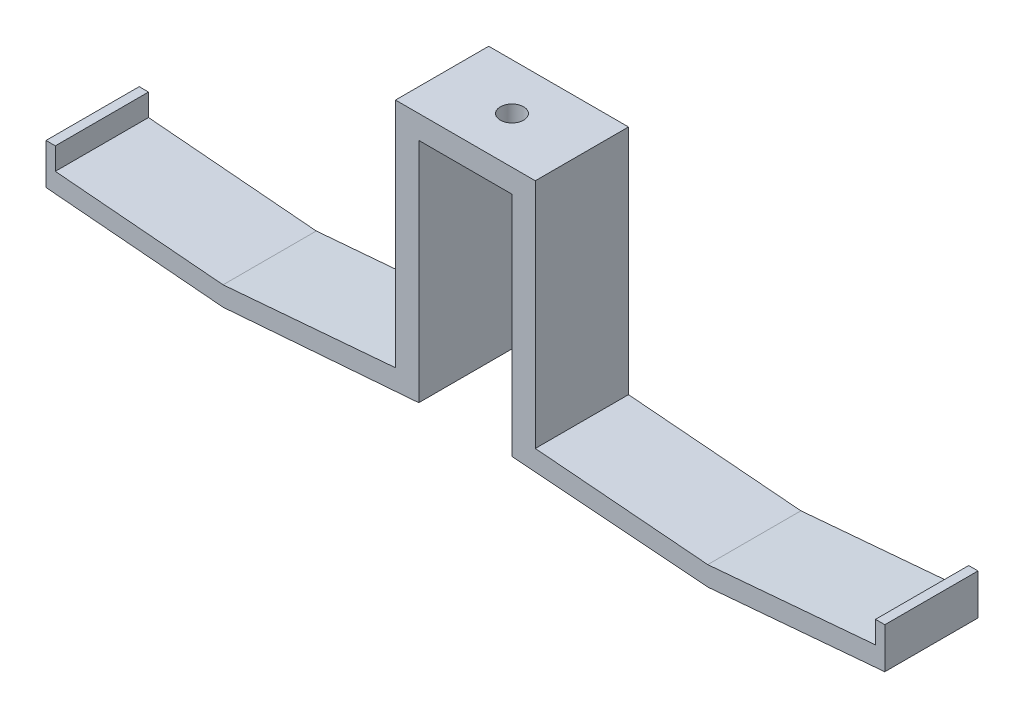
ISO-10303-21;
HEADER;
FILE_DESCRIPTION(('STEP AP214'),'2;1');
FILE_NAME('part.step','',(''),(''),'','','');
FILE_SCHEMA(('AUTOMOTIVE_DESIGN { 1 0 10303 214 1 1 1 1 }'));
ENDSEC;
DATA;
#1=APPLICATION_CONTEXT('core data for automotive mechanical design processes');
#2=APPLICATION_PROTOCOL_DEFINITION('international standard','automotive_design',2000,#1);
#3=PRODUCT_CONTEXT('',#1,'mechanical');
#4=PRODUCT('Part','Part','',(#3));
#5=PRODUCT_RELATED_PRODUCT_CATEGORY('part','',(#4));
#6=PRODUCT_DEFINITION_FORMATION('','',#4);
#7=PRODUCT_DEFINITION_CONTEXT('part definition',#1,'design');
#8=PRODUCT_DEFINITION('design','',#6,#7);
#9=PRODUCT_DEFINITION_SHAPE('','',#8);
#10=(LENGTH_UNIT() NAMED_UNIT(*) SI_UNIT(.MILLI.,.METRE.));
#11=(NAMED_UNIT(*) PLANE_ANGLE_UNIT() SI_UNIT($,.RADIAN.));
#12=(NAMED_UNIT(*) SI_UNIT($,.STERADIAN.) SOLID_ANGLE_UNIT());
#13=UNCERTAINTY_MEASURE_WITH_UNIT(LENGTH_MEASURE(1.E-05),#10,'distance_accuracy_value','');
#14=(GEOMETRIC_REPRESENTATION_CONTEXT(3) GLOBAL_UNCERTAINTY_ASSIGNED_CONTEXT((#13)) GLOBAL_UNIT_ASSIGNED_CONTEXT((#10,
#11,#12)) REPRESENTATION_CONTEXT('',''));
#15=CARTESIAN_POINT('',(0.,0.,0.));
#16=DIRECTION('',(0.,0.,1.));
#17=DIRECTION('',(1.,0.,0.));
#18=AXIS2_PLACEMENT_3D('',#15,#16,#17);
#19=CARTESIAN_POINT('',(-4.57245309052157,-54.8694358998936,25.4000000000001));
#20=DIRECTION('',(0.0830454816369344,0.99654575809628,0.));
#21=DIRECTION('',(-0.99654575809628,0.0830454816369344,0.));
#22=AXIS2_PLACEMENT_3D('',#19,#20,#21);
#23=PLANE('',#22);
#24=DIRECTION('',(0.99654575809628,-0.0830454816369344,0.));
#25=VECTOR('',#24,1.);
#26=CARTESIAN_POINT('',(-4.57245309052157,-54.8694358998936,0.));
#27=LINE('',#26,#25);
#28=CARTESIAN_POINT('',(19.05,-56.8379737,0.));
#29=VERTEX_POINT('',#28);
#30=CARTESIAN_POINT('',(66.0400000000001,-60.7538071179998,0.));
#31=VERTEX_POINT('',#30);
#32=EDGE_CURVE('E202',#29,#31,#27,.T.);
#33=ORIENTED_EDGE('',*,*,#32,.F.);
#34=DIRECTION('',(0.,0.,-1.));
#35=VECTOR('',#34,1.);
#36=CARTESIAN_POINT('',(19.05,-56.8379737,25.4000000000001));
#37=LINE('',#36,#35);
#38=CARTESIAN_POINT('',(19.05,-56.8379737,25.4000000000001));
#39=VERTEX_POINT('',#38);
#40=EDGE_CURVE('E11',#39,#29,#37,.T.);
#41=ORIENTED_EDGE('',*,*,#40,.F.);
#42=DIRECTION('',(0.99654575809628,-0.0830454816369344,0.));
#43=VECTOR('',#42,1.);
#44=CARTESIAN_POINT('',(-4.57245309052157,-54.8694358998936,25.4000000000001));
#45=LINE('',#44,#43);
#46=CARTESIAN_POINT('',(66.0400000000001,-60.7538071179998,25.4000000000001));
#47=VERTEX_POINT('',#46);
#48=EDGE_CURVE('E252',#39,#47,#45,.T.);
#49=ORIENTED_EDGE('',*,*,#48,.T.);
#50=DIRECTION('',(0.,0.,-1.));
#51=VECTOR('',#50,1.);
#52=CARTESIAN_POINT('',(66.0400000000001,-60.7538071179998,25.4000000000001));
#53=LINE('',#52,#51);
#54=EDGE_CURVE('E125',#47,#31,#53,.T.);
#55=ORIENTED_EDGE('',*,*,#54,.T.);
#56=EDGE_LOOP('',(#33,#41,#49,#55));
#57=FACE_BOUND('',#56,.T.);
#58=ADVANCED_FACE('F38',(#57),#23,.T.);
#59=CARTESIAN_POINT('',(19.05,0.,25.4000000000001));
#60=DIRECTION('',(1.,0.,0.));
#61=DIRECTION('',(0.,1.,0.));
#62=AXIS2_PLACEMENT_3D('',#59,#60,#61);
#63=PLANE('',#62);
#64=DIRECTION('',(0.,-1.,0.));
#65=VECTOR('',#64,1.);
#66=CARTESIAN_POINT('',(19.05,0.,0.));
#67=LINE('',#66,#65);
#68=CARTESIAN_POINT('',(19.05,6.35000000000008,0.));
#69=VERTEX_POINT('',#68);
#70=EDGE_CURVE('E205',#69,#29,#67,.T.);
#71=ORIENTED_EDGE('',*,*,#70,.F.);
#72=DIRECTION('',(0.,0.,-1.));
#73=VECTOR('',#72,1.);
#74=CARTESIAN_POINT('',(19.05,6.35000000000008,25.4000000000001));
#75=LINE('',#74,#73);
#76=CARTESIAN_POINT('',(19.05,6.35000000000008,25.4000000000001));
#77=VERTEX_POINT('',#76);
#78=EDGE_CURVE('E46',#77,#69,#75,.T.);
#79=ORIENTED_EDGE('',*,*,#78,.F.);
#80=DIRECTION('',(0.,-1.,0.));
#81=VECTOR('',#80,1.);
#82=CARTESIAN_POINT('',(19.05,0.,25.4000000000001));
#83=LINE('',#82,#81);
#84=EDGE_CURVE('E303',#77,#39,#83,.T.);
#85=ORIENTED_EDGE('',*,*,#84,.T.);
#86=ORIENTED_EDGE('',*,*,#40,.T.);
#87=EDGE_LOOP('',(#71,#79,#85,#86));
#88=FACE_BOUND('',#87,.T.);
#89=ADVANCED_FACE('F302',(#88),#63,.T.);
#90=CARTESIAN_POINT('',(0.,6.35000000000008,25.4000000000001));
#91=DIRECTION('',(0.,-1.,0.));
#92=DIRECTION('',(0.,0.,-1.));
#93=AXIS2_PLACEMENT_3D('',#90,#91,#92);
#94=PLANE('',#93);
#95=CARTESIAN_POINT('',(0.,6.35000000000008,12.6999999999999));
#96=DIRECTION('',(0.,1.,0.));
#97=DIRECTION('',(0.,0.,1.));
#98=AXIS2_PLACEMENT_3D('',#95,#96,#97);
#99=CIRCLE('',#98,3.175);
#100=CARTESIAN_POINT('',(0.,6.35000000000008,15.8749999999999));
#101=VERTEX_POINT('',#100);
#102=EDGE_CURVE('E206',#101,#101,#99,.T.);
#103=ORIENTED_EDGE('',*,*,#102,.F.);
#104=EDGE_LOOP('',(#103));
#105=FACE_BOUND('',#104,.T.);
#106=DIRECTION('',(-1.,0.,0.));
#107=VECTOR('',#106,1.);
#108=CARTESIAN_POINT('',(0.,6.35000000000008,0.));
#109=LINE('',#108,#107);
#110=CARTESIAN_POINT('',(-19.05,6.35000000000008,0.));
#111=VERTEX_POINT('',#110);
#112=EDGE_CURVE('E209',#69,#111,#109,.T.);
#113=ORIENTED_EDGE('',*,*,#112,.T.);
#114=DIRECTION('',(0.,0.,-1.));
#115=VECTOR('',#114,1.);
#116=CARTESIAN_POINT('',(-19.05,6.35000000000008,25.4000000000001));
#117=LINE('',#116,#115);
#118=CARTESIAN_POINT('',(-19.05,6.35000000000008,25.4000000000001));
#119=VERTEX_POINT('',#118);
#120=EDGE_CURVE('E286',#119,#111,#117,.T.);
#121=ORIENTED_EDGE('',*,*,#120,.F.);
#122=DIRECTION('',(-1.,0.,0.));
#123=VECTOR('',#122,1.);
#124=CARTESIAN_POINT('',(0.,6.35000000000008,25.4000000000001));
#125=LINE('',#124,#123);
#126=EDGE_CURVE('E293',#77,#119,#125,.T.);
#127=ORIENTED_EDGE('',*,*,#126,.F.);
#128=ORIENTED_EDGE('',*,*,#78,.T.);
#129=EDGE_LOOP('',(#113,#121,#127,#128));
#130=FACE_BOUND('',#129,.T.);
#131=ADVANCED_FACE('F291',(#105,#130),#94,.F.);
#132=CARTESIAN_POINT('',(-19.05,0.,25.4000000000001));
#133=DIRECTION('',(1.,0.,0.));
#134=DIRECTION('',(0.,1.,0.));
#135=AXIS2_PLACEMENT_3D('',#132,#133,#134);
#136=PLANE('',#135);
#137=DIRECTION('',(0.,-1.,0.));
#138=VECTOR('',#137,1.);
#139=CARTESIAN_POINT('',(-19.05,0.,0.));
#140=LINE('',#139,#138);
#141=CARTESIAN_POINT('',(-19.05,-56.8379737,0.));
#142=VERTEX_POINT('',#141);
#143=EDGE_CURVE('E211',#111,#142,#140,.T.);
#144=ORIENTED_EDGE('',*,*,#143,.T.);
#145=DIRECTION('',(0.,0.,-1.));
#146=VECTOR('',#145,1.);
#147=CARTESIAN_POINT('',(-19.05,-56.8379737,25.4000000000001));
#148=LINE('',#147,#146);
#149=CARTESIAN_POINT('',(-19.05,-56.8379737,25.4000000000001));
#150=VERTEX_POINT('',#149);
#151=EDGE_CURVE('E283',#150,#142,#148,.T.);
#152=ORIENTED_EDGE('',*,*,#151,.F.);
#153=DIRECTION('',(0.,-1.,0.));
#154=VECTOR('',#153,1.);
#155=CARTESIAN_POINT('',(-19.05,0.,25.4000000000001));
#156=LINE('',#155,#154);
#157=EDGE_CURVE('E314',#119,#150,#156,.T.);
#158=ORIENTED_EDGE('',*,*,#157,.F.);
#159=ORIENTED_EDGE('',*,*,#120,.T.);
#160=EDGE_LOOP('',(#144,#152,#158,#159));
#161=FACE_BOUND('',#160,.T.);
#162=ADVANCED_FACE('F404',(#161),#136,.F.);
#163=CARTESIAN_POINT('',(4.57245309052157,-54.8694358998936,25.4000000000001));
#164=DIRECTION('',(0.0830454816369345,-0.99654575809628,0.));
#165=DIRECTION('',(0.99654575809628,0.0830454816369345,0.));
#166=AXIS2_PLACEMENT_3D('',#163,#164,#165);
#167=PLANE('',#166);
#168=DIRECTION('',(-0.99654575809628,-0.0830454816369345,0.));
#169=VECTOR('',#168,1.);
#170=CARTESIAN_POINT('',(4.57245309052157,-54.8694358998936,0.));
#171=LINE('',#170,#169);
#172=CARTESIAN_POINT('',(-66.04,-60.753807118,0.));
#173=VERTEX_POINT('',#172);
#174=EDGE_CURVE('E213',#142,#173,#171,.T.);
#175=ORIENTED_EDGE('',*,*,#174,.T.);
#176=DIRECTION('',(0.,0.,-1.));
#177=VECTOR('',#176,1.);
#178=CARTESIAN_POINT('',(-66.04,-60.753807118,25.4000000000001));
#179=LINE('',#178,#177);
#180=CARTESIAN_POINT('',(-66.04,-60.753807118,25.4000000000001));
#181=VERTEX_POINT('',#180);
#182=EDGE_CURVE('E281',#181,#173,#179,.T.);
#183=ORIENTED_EDGE('',*,*,#182,.F.);
#184=DIRECTION('',(-0.99654575809628,-0.0830454816369345,0.));
#185=VECTOR('',#184,1.);
#186=CARTESIAN_POINT('',(4.57245309052157,-54.8694358998936,25.4000000000001));
#187=LINE('',#186,#185);
#188=EDGE_CURVE('E316',#150,#181,#187,.T.);
#189=ORIENTED_EDGE('',*,*,#188,.F.);
#190=ORIENTED_EDGE('',*,*,#151,.T.);
#191=EDGE_LOOP('',(#175,#183,#189,#190));
#192=FACE_BOUND('',#191,.T.);
#193=ADVANCED_FACE('F400',(#192),#167,.F.);
#194=CARTESIAN_POINT('',(-5.64647427056286,-65.9264008687037,25.4000000000001));
#195=DIRECTION('',(0.0853357272861369,0.996352253798096,0.));
#196=DIRECTION('',(-0.996352253798096,0.0853357272861369,0.));
#197=AXIS2_PLACEMENT_3D('',#194,#195,#196);
#198=PLANE('',#197);
#199=DIRECTION('',(0.996352253798096,-0.0853357272861369,0.));
#200=VECTOR('',#199,1.);
#201=CARTESIAN_POINT('',(-5.64647427056286,-65.9264008687037,0.));
#202=LINE('',#201,#200);
#203=CARTESIAN_POINT('',(-111.76,-56.8379737,0.));
#204=VERTEX_POINT('',#203);
#205=EDGE_CURVE('E216',#204,#173,#202,.T.);
#206=ORIENTED_EDGE('',*,*,#205,.F.);
#207=DIRECTION('',(0.,0.,-1.));
#208=VECTOR('',#207,1.);
#209=CARTESIAN_POINT('',(-111.76,-56.8379737,25.4000000000001));
#210=LINE('',#209,#208);
#211=CARTESIAN_POINT('',(-111.76,-56.8379737,25.4000000000001));
#212=VERTEX_POINT('',#211);
#213=EDGE_CURVE('E279',#212,#204,#210,.T.);
#214=ORIENTED_EDGE('',*,*,#213,.F.);
#215=DIRECTION('',(0.996352253798096,-0.0853357272861369,0.));
#216=VECTOR('',#215,1.);
#217=CARTESIAN_POINT('',(-5.64647427056286,-65.9264008687037,25.4000000000001));
#218=LINE('',#217,#216);
#219=EDGE_CURVE('E318',#212,#181,#218,.T.);
#220=ORIENTED_EDGE('',*,*,#219,.T.);
#221=ORIENTED_EDGE('',*,*,#182,.T.);
#222=EDGE_LOOP('',(#206,#214,#220,#221));
#223=FACE_BOUND('',#222,.T.);
#224=ADVANCED_FACE('F395',(#223),#198,.T.);
#225=CARTESIAN_POINT('',(-111.76,6.66133814775094E-13,25.4000000000001));
#226=DIRECTION('',(1.,0.,0.));
#227=DIRECTION('',(0.,1.,0.));
#228=AXIS2_PLACEMENT_3D('',#225,#226,#227);
#229=PLANE('',#228);
#230=DIRECTION('',(0.,-1.,0.));
#231=VECTOR('',#230,1.);
#232=CARTESIAN_POINT('',(-111.76,6.66133814775094E-13,0.));
#233=LINE('',#232,#231);
#234=CARTESIAN_POINT('',(-111.76,-50.811353419,0.));
#235=VERTEX_POINT('',#234);
#236=EDGE_CURVE('E219',#235,#204,#233,.T.);
#237=ORIENTED_EDGE('',*,*,#236,.F.);
#238=DIRECTION('',(0.,0.,-1.));
#239=VECTOR('',#238,1.);
#240=CARTESIAN_POINT('',(-111.76,-50.811353419,25.4000000000001));
#241=LINE('',#240,#239);
#242=CARTESIAN_POINT('',(-111.76,-50.811353419,25.4000000000001));
#243=VERTEX_POINT('',#242);
#244=EDGE_CURVE('E277',#243,#235,#241,.T.);
#245=ORIENTED_EDGE('',*,*,#244,.F.);
#246=DIRECTION('',(0.,-1.,0.));
#247=VECTOR('',#246,1.);
#248=CARTESIAN_POINT('',(-111.76,6.66133814775094E-13,25.4000000000001));
#249=LINE('',#248,#247);
#250=EDGE_CURVE('E321',#243,#212,#249,.T.);
#251=ORIENTED_EDGE('',*,*,#250,.T.);
#252=ORIENTED_EDGE('',*,*,#213,.T.);
#253=EDGE_LOOP('',(#237,#245,#251,#252));
#254=FACE_BOUND('',#253,.T.);
#255=ADVANCED_FACE('F392',(#254),#229,.T.);
#256=CARTESIAN_POINT('',(0.,-50.811353419,25.4000000000001));
#257=DIRECTION('',(0.,1.,0.));
#258=DIRECTION('',(0.,0.,1.));
#259=AXIS2_PLACEMENT_3D('',#256,#257,#258);
#260=PLANE('',#259);
#261=DIRECTION('',(1.,0.,0.));
#262=VECTOR('',#261,1.);
#263=CARTESIAN_POINT('',(0.,-50.811353419,0.));
#264=LINE('',#263,#262);
#265=CARTESIAN_POINT('',(-114.3,-50.811353419,0.));
#266=VERTEX_POINT('',#265);
#267=EDGE_CURVE('E222',#266,#235,#264,.T.);
#268=ORIENTED_EDGE('',*,*,#267,.F.);
#269=DIRECTION('',(0.,0.,-1.));
#270=VECTOR('',#269,1.);
#271=CARTESIAN_POINT('',(-114.3,-50.811353419,25.4000000000001));
#272=LINE('',#271,#270);
#273=CARTESIAN_POINT('',(-114.3,-50.811353419,25.4000000000001));
#274=VERTEX_POINT('',#273);
#275=EDGE_CURVE('E275',#274,#266,#272,.T.);
#276=ORIENTED_EDGE('',*,*,#275,.F.);
#277=DIRECTION('',(1.,0.,0.));
#278=VECTOR('',#277,1.);
#279=CARTESIAN_POINT('',(0.,-50.811353419,25.4000000000001));
#280=LINE('',#279,#278);
#281=EDGE_CURVE('E324',#274,#243,#280,.T.);
#282=ORIENTED_EDGE('',*,*,#281,.T.);
#283=ORIENTED_EDGE('',*,*,#244,.T.);
#284=EDGE_LOOP('',(#268,#276,#282,#283));
#285=FACE_BOUND('',#284,.T.);
#286=ADVANCED_FACE('F388',(#285),#260,.T.);
#287=CARTESIAN_POINT('',(-114.3,4.44089209850063E-13,25.4000000000001));
#288=DIRECTION('',(-1.,0.,0.));
#289=DIRECTION('',(0.,-1.,0.));
#290=AXIS2_PLACEMENT_3D('',#287,#288,#289);
#291=PLANE('',#290);
#292=DIRECTION('',(0.,1.,0.));
#293=VECTOR('',#292,1.);
#294=CARTESIAN_POINT('',(-114.3,4.44089209850063E-13,0.));
#295=LINE('',#294,#293);
#296=CARTESIAN_POINT('',(-114.3,-61.9179737000002,0.));
#297=VERTEX_POINT('',#296);
#298=EDGE_CURVE('E225',#297,#266,#295,.T.);
#299=ORIENTED_EDGE('',*,*,#298,.F.);
#300=DIRECTION('',(0.,0.,-1.));
#301=VECTOR('',#300,1.);
#302=CARTESIAN_POINT('',(-114.3,-61.9179737000002,25.4000000000001));
#303=LINE('',#302,#301);
#304=CARTESIAN_POINT('',(-114.3,-61.9179737000002,25.4000000000001));
#305=VERTEX_POINT('',#304);
#306=EDGE_CURVE('E273',#305,#297,#303,.T.);
#307=ORIENTED_EDGE('',*,*,#306,.F.);
#308=DIRECTION('',(0.,1.,0.));
#309=VECTOR('',#308,1.);
#310=CARTESIAN_POINT('',(-114.3,4.44089209850063E-13,25.4000000000001));
#311=LINE('',#310,#309);
#312=EDGE_CURVE('E327',#305,#274,#311,.T.);
#313=ORIENTED_EDGE('',*,*,#312,.T.);
#314=ORIENTED_EDGE('',*,*,#275,.T.);
#315=EDGE_LOOP('',(#299,#307,#313,#314));
#316=FACE_BOUND('',#315,.T.);
#317=ADVANCED_FACE('F384',(#316),#291,.T.);
#318=CARTESIAN_POINT('',(-6.09689520048762,-71.1853694503344,25.4000000000001));
#319=DIRECTION('',(-0.0853357272861369,-0.996352253798096,0.));
#320=DIRECTION('',(0.996352253798096,-0.0853357272861369,0.));
#321=AXIS2_PLACEMENT_3D('',#318,#319,#320);
#322=PLANE('',#321);
#323=DIRECTION('',(-0.996352253798096,0.0853357272861369,0.));
#324=VECTOR('',#323,1.);
#325=CARTESIAN_POINT('',(-6.09689520048762,-71.1853694503344,0.));
#326=LINE('',#325,#324);
#327=CARTESIAN_POINT('',(-66.04,-66.0513534189999,0.));
#328=VERTEX_POINT('',#327);
#329=EDGE_CURVE('E228',#328,#297,#326,.T.);
#330=ORIENTED_EDGE('',*,*,#329,.F.);
#331=DIRECTION('',(0.,0.,-1.));
#332=VECTOR('',#331,1.);
#333=CARTESIAN_POINT('',(-66.04,-66.0513534189999,25.4000000000001));
#334=LINE('',#333,#332);
#335=CARTESIAN_POINT('',(-66.04,-66.0513534189999,25.4000000000001));
#336=VERTEX_POINT('',#335);
#337=EDGE_CURVE('E271',#336,#328,#334,.T.);
#338=ORIENTED_EDGE('',*,*,#337,.F.);
#339=DIRECTION('',(-0.996352253798096,0.0853357272861369,0.));
#340=VECTOR('',#339,1.);
#341=CARTESIAN_POINT('',(-6.09689520048762,-71.1853694503344,25.4000000000001));
#342=LINE('',#341,#340);
#343=EDGE_CURVE('E330',#336,#305,#342,.T.);
#344=ORIENTED_EDGE('',*,*,#343,.T.);
#345=ORIENTED_EDGE('',*,*,#306,.T.);
#346=EDGE_LOOP('',(#330,#338,#344,#345));
#347=FACE_BOUND('',#346,.T.);
#348=ADVANCED_FACE('F380',(#347),#322,.T.);
#349=CARTESIAN_POINT('',(4.69365020857038,-60.5701191628518,25.4000000000001));
#350=DIRECTION('',(0.0772595631880117,-0.997011012926135,0.));
#351=DIRECTION('',(0.997011012926135,0.0772595631880117,0.));
#352=AXIS2_PLACEMENT_3D('',#349,#350,#351);
#353=PLANE('',#352);
#354=DIRECTION('',(-0.997011012926135,-0.0772595631880117,0.));
#355=VECTOR('',#354,1.);
#356=CARTESIAN_POINT('',(4.69365020857038,-60.5701191628518,0.));
#357=LINE('',#356,#355);
#358=CARTESIAN_POINT('',(-12.6999999999999,-61.9179737,0.));
#359=VERTEX_POINT('',#358);
#360=EDGE_CURVE('E231',#359,#328,#357,.T.);
#361=ORIENTED_EDGE('',*,*,#360,.F.);
#362=DIRECTION('',(0.,0.,-1.));
#363=VECTOR('',#362,1.);
#364=CARTESIAN_POINT('',(-12.6999999999999,-61.9179737,25.4000000000001));
#365=LINE('',#364,#363);
#366=CARTESIAN_POINT('',(-12.6999999999999,-61.9179737,25.4000000000001));
#367=VERTEX_POINT('',#366);
#368=EDGE_CURVE('E269',#367,#359,#365,.T.);
#369=ORIENTED_EDGE('',*,*,#368,.F.);
#370=DIRECTION('',(-0.997011012926135,-0.0772595631880117,0.));
#371=VECTOR('',#370,1.);
#372=CARTESIAN_POINT('',(4.69365020857038,-60.5701191628518,25.4000000000001));
#373=LINE('',#372,#371);
#374=EDGE_CURVE('E333',#367,#336,#373,.T.);
#375=ORIENTED_EDGE('',*,*,#374,.T.);
#376=ORIENTED_EDGE('',*,*,#337,.T.);
#377=EDGE_LOOP('',(#361,#369,#375,#376));
#378=FACE_BOUND('',#377,.T.);
#379=ADVANCED_FACE('F376',(#378),#353,.T.);
#380=CARTESIAN_POINT('',(-12.6999999999999,0.,25.4000000000001));
#381=DIRECTION('',(1.,0.,0.));
#382=DIRECTION('',(0.,1.,0.));
#383=AXIS2_PLACEMENT_3D('',#380,#381,#382);
#384=PLANE('',#383);
#385=DIRECTION('',(0.,-1.,0.));
#386=VECTOR('',#385,1.);
#387=CARTESIAN_POINT('',(-12.6999999999999,0.,0.));
#388=LINE('',#387,#386);
#389=CARTESIAN_POINT('',(-12.6999999999999,0.,0.));
#390=VERTEX_POINT('',#389);
#391=EDGE_CURVE('E234',#390,#359,#388,.T.);
#392=ORIENTED_EDGE('',*,*,#391,.F.);
#393=DIRECTION('',(0.,0.,-1.));
#394=VECTOR('',#393,1.);
#395=CARTESIAN_POINT('',(-12.6999999999999,0.,25.4000000000001));
#396=LINE('',#395,#394);
#397=CARTESIAN_POINT('',(-12.6999999999999,0.,25.4000000000001));
#398=VERTEX_POINT('',#397);
#399=EDGE_CURVE('E267',#398,#390,#396,.T.);
#400=ORIENTED_EDGE('',*,*,#399,.F.);
#401=DIRECTION('',(0.,-1.,0.));
#402=VECTOR('',#401,1.);
#403=CARTESIAN_POINT('',(-12.6999999999999,0.,25.4000000000001));
#404=LINE('',#403,#402);
#405=EDGE_CURVE('E336',#398,#367,#404,.T.);
#406=ORIENTED_EDGE('',*,*,#405,.T.);
#407=ORIENTED_EDGE('',*,*,#368,.T.);
#408=EDGE_LOOP('',(#392,#400,#406,#407));
#409=FACE_BOUND('',#408,.T.);
#410=ADVANCED_FACE('F372',(#409),#384,.T.);
#411=CARTESIAN_POINT('',(0.,0.,25.4000000000001));
#412=DIRECTION('',(0.,-1.,0.));
#413=DIRECTION('',(0.,0.,-1.));
#414=AXIS2_PLACEMENT_3D('',#411,#412,#413);
#415=PLANE('',#414);
#416=CARTESIAN_POINT('',(0.,0.,12.6999999999999));
#417=DIRECTION('',(0.,-1.,0.));
#418=DIRECTION('',(0.,0.,-1.));
#419=AXIS2_PLACEMENT_3D('',#416,#417,#418);
#420=CIRCLE('',#419,3.175);
#421=CARTESIAN_POINT('',(0.,0.,9.52499999999993));
#422=VERTEX_POINT('',#421);
#423=EDGE_CURVE('E310',#422,#422,#420,.F.);
#424=ORIENTED_EDGE('',*,*,#423,.T.);
#425=EDGE_LOOP('',(#424));
#426=FACE_BOUND('',#425,.T.);
#427=DIRECTION('',(-1.,0.,0.));
#428=VECTOR('',#427,1.);
#429=CARTESIAN_POINT('',(0.,0.,0.));
#430=LINE('',#429,#428);
#431=CARTESIAN_POINT('',(12.6999999999999,0.,0.));
#432=VERTEX_POINT('',#431);
#433=EDGE_CURVE('E237',#432,#390,#430,.T.);
#434=ORIENTED_EDGE('',*,*,#433,.F.);
#435=DIRECTION('',(0.,0.,-1.));
#436=VECTOR('',#435,1.);
#437=CARTESIAN_POINT('',(12.6999999999999,0.,25.4000000000001));
#438=LINE('',#437,#436);
#439=CARTESIAN_POINT('',(12.6999999999999,0.,25.4000000000001));
#440=VERTEX_POINT('',#439);
#441=EDGE_CURVE('E265',#440,#432,#438,.T.);
#442=ORIENTED_EDGE('',*,*,#441,.F.);
#443=DIRECTION('',(-1.,0.,0.));
#444=VECTOR('',#443,1.);
#445=CARTESIAN_POINT('',(0.,0.,25.4000000000001));
#446=LINE('',#445,#444);
#447=EDGE_CURVE('E339',#440,#398,#446,.T.);
#448=ORIENTED_EDGE('',*,*,#447,.T.);
#449=ORIENTED_EDGE('',*,*,#399,.T.);
#450=EDGE_LOOP('',(#434,#442,#448,#449));
#451=FACE_BOUND('',#450,.T.);
#452=ADVANCED_FACE('F368',(#426,#451),#415,.T.);
#453=CARTESIAN_POINT('',(12.6999999999999,0.,25.4000000000001));
#454=DIRECTION('',(1.,0.,0.));
#455=DIRECTION('',(0.,1.,0.));
#456=AXIS2_PLACEMENT_3D('',#453,#454,#455);
#457=PLANE('',#456);
#458=DIRECTION('',(0.,-1.,0.));
#459=VECTOR('',#458,1.);
#460=CARTESIAN_POINT('',(12.6999999999999,0.,0.));
#461=LINE('',#460,#459);
#462=CARTESIAN_POINT('',(12.6999999999999,-61.9179737,0.));
#463=VERTEX_POINT('',#462);
#464=EDGE_CURVE('E240',#432,#463,#461,.T.);
#465=ORIENTED_EDGE('',*,*,#464,.T.);
#466=DIRECTION('',(0.,0.,-1.));
#467=VECTOR('',#466,1.);
#468=CARTESIAN_POINT('',(12.6999999999999,-61.9179737,25.4000000000001));
#469=LINE('',#468,#467);
#470=CARTESIAN_POINT('',(12.6999999999999,-61.9179737,25.4000000000001));
#471=VERTEX_POINT('',#470);
#472=EDGE_CURVE('E262',#471,#463,#469,.T.);
#473=ORIENTED_EDGE('',*,*,#472,.F.);
#474=DIRECTION('',(0.,-1.,0.));
#475=VECTOR('',#474,1.);
#476=CARTESIAN_POINT('',(12.6999999999999,0.,25.4000000000001));
#477=LINE('',#476,#475);
#478=EDGE_CURVE('E342',#440,#471,#477,.T.);
#479=ORIENTED_EDGE('',*,*,#478,.F.);
#480=ORIENTED_EDGE('',*,*,#441,.T.);
#481=EDGE_LOOP('',(#465,#473,#479,#480));
#482=FACE_BOUND('',#481,.T.);
#483=ADVANCED_FACE('F365',(#482),#457,.F.);
#484=CARTESIAN_POINT('',(-4.69365020857038,-60.5701191628518,25.4000000000001));
#485=DIRECTION('',(0.0772595631880114,0.997011012926135,0.));
#486=DIRECTION('',(-0.997011012926135,0.0772595631880114,0.));
#487=AXIS2_PLACEMENT_3D('',#484,#485,#486);
#488=PLANE('',#487);
#489=DIRECTION('',(0.997011012926135,-0.0772595631880114,0.));
#490=VECTOR('',#489,1.);
#491=CARTESIAN_POINT('',(-4.69365020857038,-60.5701191628518,0.));
#492=LINE('',#491,#490);
#493=CARTESIAN_POINT('',(66.0400000000001,-66.0513534189999,0.));
#494=VERTEX_POINT('',#493);
#495=EDGE_CURVE('E242',#463,#494,#492,.T.);
#496=ORIENTED_EDGE('',*,*,#495,.T.);
#497=DIRECTION('',(0.,0.,-1.));
#498=VECTOR('',#497,1.);
#499=CARTESIAN_POINT('',(66.0400000000001,-66.0513534189999,25.4000000000001));
#500=LINE('',#499,#498);
#501=CARTESIAN_POINT('',(66.0400000000001,-66.0513534189999,25.4000000000001));
#502=VERTEX_POINT('',#501);
#503=EDGE_CURVE('E259',#502,#494,#500,.T.);
#504=ORIENTED_EDGE('',*,*,#503,.F.);
#505=DIRECTION('',(0.997011012926135,-0.0772595631880114,0.));
#506=VECTOR('',#505,1.);
#507=CARTESIAN_POINT('',(-4.69365020857038,-60.5701191628518,25.4000000000001));
#508=LINE('',#507,#506);
#509=EDGE_CURVE('E344',#471,#502,#508,.T.);
#510=ORIENTED_EDGE('',*,*,#509,.F.);
#511=ORIENTED_EDGE('',*,*,#472,.T.);
#512=EDGE_LOOP('',(#496,#504,#510,#511));
#513=FACE_BOUND('',#512,.T.);
#514=ADVANCED_FACE('F361',(#513),#488,.F.);
#515=CARTESIAN_POINT('',(6.09689520048762,-71.1853694503344,25.4000000000001));
#516=DIRECTION('',(-0.0853357272861372,0.996352253798096,0.));
#517=DIRECTION('',(-0.996352253798096,-0.0853357272861372,0.));
#518=AXIS2_PLACEMENT_3D('',#515,#516,#517);
#519=PLANE('',#518);
#520=DIRECTION('',(0.996352253798096,0.0853357272861372,0.));
#521=VECTOR('',#520,1.);
#522=CARTESIAN_POINT('',(6.09689520048762,-71.1853694503344,0.));
#523=LINE('',#522,#521);
#524=CARTESIAN_POINT('',(114.3,-61.9179737,0.));
#525=VERTEX_POINT('',#524);
#526=EDGE_CURVE('E244',#494,#525,#523,.T.);
#527=ORIENTED_EDGE('',*,*,#526,.T.);
#528=DIRECTION('',(0.,0.,-1.));
#529=VECTOR('',#528,1.);
#530=CARTESIAN_POINT('',(114.3,-61.9179737,25.4000000000001));
#531=LINE('',#530,#529);
#532=CARTESIAN_POINT('',(114.3,-61.9179737,25.4000000000001));
#533=VERTEX_POINT('',#532);
#534=EDGE_CURVE('E256',#533,#525,#531,.T.);
#535=ORIENTED_EDGE('',*,*,#534,.F.);
#536=DIRECTION('',(0.996352253798096,0.0853357272861372,0.));
#537=VECTOR('',#536,1.);
#538=CARTESIAN_POINT('',(6.09689520048762,-71.1853694503344,25.4000000000001));
#539=LINE('',#538,#537);
#540=EDGE_CURVE('E346',#502,#533,#539,.T.);
#541=ORIENTED_EDGE('',*,*,#540,.F.);
#542=ORIENTED_EDGE('',*,*,#503,.T.);
#543=EDGE_LOOP('',(#527,#535,#541,#542));
#544=FACE_BOUND('',#543,.T.);
#545=ADVANCED_FACE('F352',(#544),#519,.F.);
#546=CARTESIAN_POINT('',(114.3,2.22044604925031E-13,25.4000000000001));
#547=DIRECTION('',(-1.,0.,0.));
#548=DIRECTION('',(0.,-1.,0.));
#549=AXIS2_PLACEMENT_3D('',#546,#547,#548);
#550=PLANE('',#549);
#551=DIRECTION('',(0.,1.,0.));
#552=VECTOR('',#551,1.);
#553=CARTESIAN_POINT('',(114.3,2.22044604925031E-13,0.));
#554=LINE('',#553,#552);
#555=CARTESIAN_POINT('',(114.3,-50.811353419,0.));
#556=VERTEX_POINT('',#555);
#557=EDGE_CURVE('E246',#525,#556,#554,.T.);
#558=ORIENTED_EDGE('',*,*,#557,.T.);
#559=DIRECTION('',(0.,0.,-1.));
#560=VECTOR('',#559,1.);
#561=CARTESIAN_POINT('',(114.3,-50.811353419,25.4000000000001));
#562=LINE('',#561,#560);
#563=CARTESIAN_POINT('',(114.3,-50.811353419,25.4000000000001));
#564=VERTEX_POINT('',#563);
#565=EDGE_CURVE('E194',#564,#556,#562,.T.);
#566=ORIENTED_EDGE('',*,*,#565,.F.);
#567=DIRECTION('',(0.,1.,0.));
#568=VECTOR('',#567,1.);
#569=CARTESIAN_POINT('',(114.3,2.22044604925031E-13,25.4000000000001));
#570=LINE('',#569,#568);
#571=EDGE_CURVE('E185',#533,#564,#570,.T.);
#572=ORIENTED_EDGE('',*,*,#571,.F.);
#573=ORIENTED_EDGE('',*,*,#534,.T.);
#574=EDGE_LOOP('',(#558,#566,#572,#573));
#575=FACE_BOUND('',#574,.T.);
#576=ADVANCED_FACE('F356',(#575),#550,.F.);
#577=CARTESIAN_POINT('',(0.,-50.811353419,25.4000000000001));
#578=DIRECTION('',(0.,-1.,0.));
#579=DIRECTION('',(0.,0.,-1.));
#580=AXIS2_PLACEMENT_3D('',#577,#578,#579);
#581=PLANE('',#580);
#582=DIRECTION('',(-1.,0.,0.));
#583=VECTOR('',#582,1.);
#584=CARTESIAN_POINT('',(0.,-50.811353419,0.));
#585=LINE('',#584,#583);
#586=CARTESIAN_POINT('',(111.76,-50.811353419,0.));
#587=VERTEX_POINT('',#586);
#588=EDGE_CURVE('E193',#556,#587,#585,.T.);
#589=ORIENTED_EDGE('',*,*,#588,.T.);
#590=DIRECTION('',(0.,0.,-1.));
#591=VECTOR('',#590,1.);
#592=CARTESIAN_POINT('',(111.76,-50.811353419,25.4000000000001));
#593=LINE('',#592,#591);
#594=CARTESIAN_POINT('',(111.76,-50.811353419,25.4000000000001));
#595=VERTEX_POINT('',#594);
#596=EDGE_CURVE('E190',#595,#587,#593,.T.);
#597=ORIENTED_EDGE('',*,*,#596,.F.);
#598=DIRECTION('',(-1.,0.,0.));
#599=VECTOR('',#598,1.);
#600=CARTESIAN_POINT('',(0.,-50.811353419,25.4000000000001));
#601=LINE('',#600,#599);
#602=EDGE_CURVE('E179',#564,#595,#601,.T.);
#603=ORIENTED_EDGE('',*,*,#602,.F.);
#604=ORIENTED_EDGE('',*,*,#565,.T.);
#605=EDGE_LOOP('',(#589,#597,#603,#604));
#606=FACE_BOUND('',#605,.T.);
#607=ADVANCED_FACE('F191',(#606),#581,.F.);
#608=CARTESIAN_POINT('',(111.76,2.22044604925031E-13,25.4000000000001));
#609=DIRECTION('',(1.,0.,0.));
#610=DIRECTION('',(0.,1.,0.));
#611=AXIS2_PLACEMENT_3D('',#608,#609,#610);
#612=PLANE('',#611);
#613=DIRECTION('',(0.,-1.,0.));
#614=VECTOR('',#613,1.);
#615=CARTESIAN_POINT('',(111.76,2.22044604925031E-13,0.));
#616=LINE('',#615,#614);
#617=CARTESIAN_POINT('',(111.76,-56.8379737,0.));
#618=VERTEX_POINT('',#617);
#619=EDGE_CURVE('E118',#587,#618,#616,.T.);
#620=ORIENTED_EDGE('',*,*,#619,.T.);
#621=DIRECTION('',(0.,0.,-1.));
#622=VECTOR('',#621,1.);
#623=CARTESIAN_POINT('',(111.76,-56.8379737,25.4000000000001));
#624=LINE('',#623,#622);
#625=CARTESIAN_POINT('',(111.76,-56.8379737,25.4000000000001));
#626=VERTEX_POINT('',#625);
#627=EDGE_CURVE('E195',#626,#618,#624,.T.);
#628=ORIENTED_EDGE('',*,*,#627,.F.);
#629=DIRECTION('',(0.,-1.,0.));
#630=VECTOR('',#629,1.);
#631=CARTESIAN_POINT('',(111.76,2.22044604925031E-13,25.4000000000001));
#632=LINE('',#631,#630);
#633=EDGE_CURVE('E183',#595,#626,#632,.T.);
#634=ORIENTED_EDGE('',*,*,#633,.F.);
#635=ORIENTED_EDGE('',*,*,#596,.T.);
#636=EDGE_LOOP('',(#620,#628,#634,#635));
#637=FACE_BOUND('',#636,.T.);
#638=ADVANCED_FACE('F197',(#637),#612,.F.);
#639=CARTESIAN_POINT('',(5.64647427056286,-65.9264008687037,25.4000000000001));
#640=DIRECTION('',(0.0853357272861372,-0.996352253798096,0.));
#641=DIRECTION('',(0.996352253798096,0.0853357272861372,0.));
#642=AXIS2_PLACEMENT_3D('',#639,#640,#641);
#643=PLANE('',#642);
#644=DIRECTION('',(-0.996352253798096,-0.0853357272861372,0.));
#645=VECTOR('',#644,1.);
#646=CARTESIAN_POINT('',(5.64647427056286,-65.9264008687037,0.));
#647=LINE('',#646,#645);
#648=EDGE_CURVE('E250',#618,#31,#647,.T.);
#649=ORIENTED_EDGE('',*,*,#648,.T.);
#650=ORIENTED_EDGE('',*,*,#54,.F.);
#651=DIRECTION('',(-0.996352253798096,-0.0853357272861372,0.));
#652=VECTOR('',#651,1.);
#653=CARTESIAN_POINT('',(5.64647427056286,-65.9264008687037,25.4000000000001));
#654=LINE('',#653,#652);
#655=EDGE_CURVE('E54',#626,#47,#654,.T.);
#656=ORIENTED_EDGE('',*,*,#655,.F.);
#657=ORIENTED_EDGE('',*,*,#627,.T.);
#658=EDGE_LOOP('',(#649,#650,#656,#657));
#659=FACE_BOUND('',#658,.T.);
#660=ADVANCED_FACE('F306',(#659),#643,.F.);
#661=CARTESIAN_POINT('',(0.,0.,25.4000000000001));
#662=DIRECTION('',(0.,0.,1.));
#663=DIRECTION('',(1.,0.,0.));
#664=AXIS2_PLACEMENT_3D('',#661,#662,#663);
#665=PLANE('',#664);
#666=ORIENTED_EDGE('',*,*,#48,.F.);
#667=ORIENTED_EDGE('',*,*,#84,.F.);
#668=ORIENTED_EDGE('',*,*,#126,.T.);
#669=ORIENTED_EDGE('',*,*,#157,.T.);
#670=ORIENTED_EDGE('',*,*,#188,.T.);
#671=ORIENTED_EDGE('',*,*,#219,.F.);
#672=ORIENTED_EDGE('',*,*,#250,.F.);
#673=ORIENTED_EDGE('',*,*,#281,.F.);
#674=ORIENTED_EDGE('',*,*,#312,.F.);
#675=ORIENTED_EDGE('',*,*,#343,.F.);
#676=ORIENTED_EDGE('',*,*,#374,.F.);
#677=ORIENTED_EDGE('',*,*,#405,.F.);
#678=ORIENTED_EDGE('',*,*,#447,.F.);
#679=ORIENTED_EDGE('',*,*,#478,.T.);
#680=ORIENTED_EDGE('',*,*,#509,.T.);
#681=ORIENTED_EDGE('',*,*,#540,.T.);
#682=ORIENTED_EDGE('',*,*,#571,.T.);
#683=ORIENTED_EDGE('',*,*,#602,.T.);
#684=ORIENTED_EDGE('',*,*,#633,.T.);
#685=ORIENTED_EDGE('',*,*,#655,.T.);
#686=EDGE_LOOP('',(#666,#667,#668,#669,#670,#671,#672,#673,#674,#675,#676,#677,#678,#679,#680,
#681,#682,#683,#684,#685));
#687=FACE_BOUND('',#686,.T.);
#688=ADVANCED_FACE('F181',(#687),#665,.T.);
#689=CARTESIAN_POINT('',(0.,0.,0.));
#690=DIRECTION('',(0.,0.,1.));
#691=DIRECTION('',(1.,0.,0.));
#692=AXIS2_PLACEMENT_3D('',#689,#690,#691);
#693=PLANE('',#692);
#694=ORIENTED_EDGE('',*,*,#32,.T.);
#695=ORIENTED_EDGE('',*,*,#648,.F.);
#696=ORIENTED_EDGE('',*,*,#619,.F.);
#697=ORIENTED_EDGE('',*,*,#588,.F.);
#698=ORIENTED_EDGE('',*,*,#557,.F.);
#699=ORIENTED_EDGE('',*,*,#526,.F.);
#700=ORIENTED_EDGE('',*,*,#495,.F.);
#701=ORIENTED_EDGE('',*,*,#464,.F.);
#702=ORIENTED_EDGE('',*,*,#433,.T.);
#703=ORIENTED_EDGE('',*,*,#391,.T.);
#704=ORIENTED_EDGE('',*,*,#360,.T.);
#705=ORIENTED_EDGE('',*,*,#329,.T.);
#706=ORIENTED_EDGE('',*,*,#298,.T.);
#707=ORIENTED_EDGE('',*,*,#267,.T.);
#708=ORIENTED_EDGE('',*,*,#236,.T.);
#709=ORIENTED_EDGE('',*,*,#205,.T.);
#710=ORIENTED_EDGE('',*,*,#174,.F.);
#711=ORIENTED_EDGE('',*,*,#143,.F.);
#712=ORIENTED_EDGE('',*,*,#112,.F.);
#713=ORIENTED_EDGE('',*,*,#70,.T.);
#714=EDGE_LOOP('',(#694,#695,#696,#697,#698,#699,#700,#701,#702,#703,#704,#705,#706,#707,#708,
#709,#710,#711,#712,#713));
#715=FACE_BOUND('',#714,.T.);
#716=ADVANCED_FACE('F300',(#715),#693,.F.);
#717=CARTESIAN_POINT('',(0.,-66.0523534190001,12.6999999999999));
#718=DIRECTION('',(0.,1.,0.));
#719=DIRECTION('',(0.,0.,1.));
#720=AXIS2_PLACEMENT_3D('',#717,#718,#719);
#721=CYLINDRICAL_SURFACE('',#720,3.175);
#722=ORIENTED_EDGE('',*,*,#423,.F.);
#723=EDGE_LOOP('',(#722));
#724=FACE_BOUND('',#723,.T.);
#725=ORIENTED_EDGE('',*,*,#102,.T.);
#726=EDGE_LOOP('',(#725));
#727=FACE_BOUND('',#726,.T.);
#728=ADVANCED_FACE('F541',(#724,#727),#721,.F.);
#729=CLOSED_SHELL('',(#58,#89,#131,#162,#193,#224,#255,#286,#317,#348,#379,#410,#452,#483,#514,
#545,#576,#607,#638,#660,#688,#716,#728));
#730=MANIFOLD_SOLID_BREP('B2',#729);
#731=ADVANCED_BREP_SHAPE_REPRESENTATION('',(#18,#730),#14);
#732=SHAPE_DEFINITION_REPRESENTATION(#9,#731);
ENDSEC;
END-ISO-10303-21;
